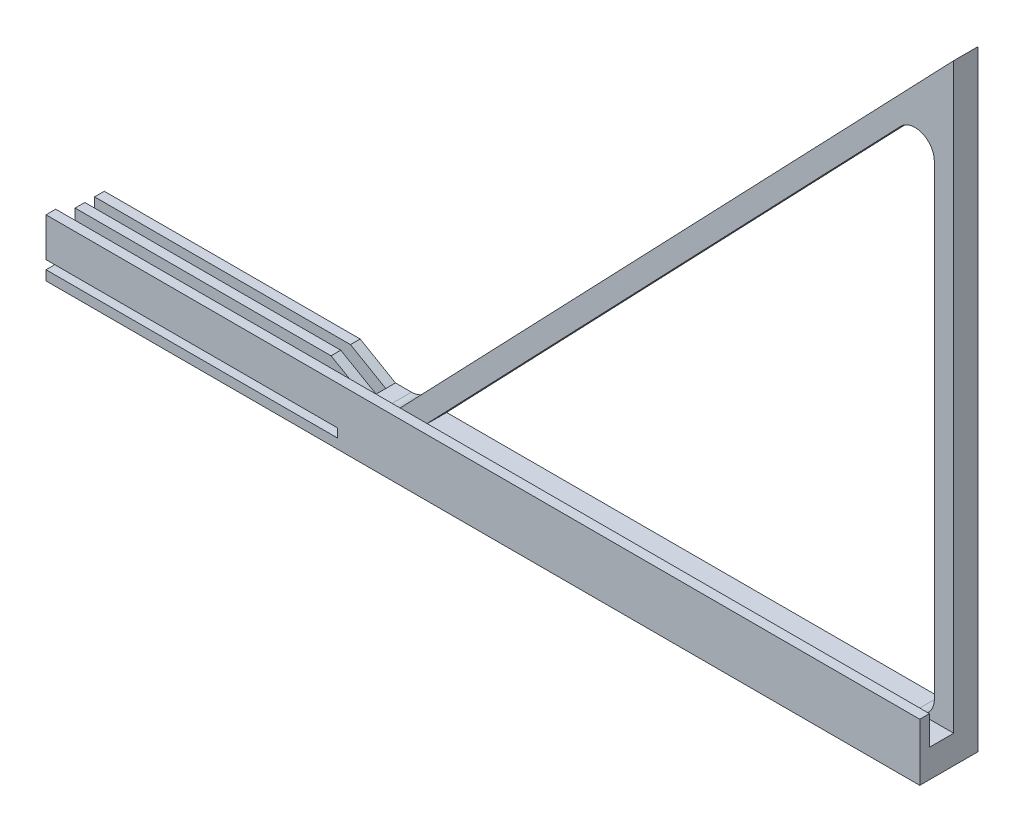
ISO-10303-21;
HEADER;
FILE_DESCRIPTION(('STEP AP214'),'2;1');
FILE_NAME('part.step','',(''),(''),'','','');
FILE_SCHEMA(('AUTOMOTIVE_DESIGN { 1 0 10303 214 1 1 1 1 }'));
ENDSEC;
DATA;
#1=APPLICATION_CONTEXT('core data for automotive mechanical design processes');
#2=APPLICATION_PROTOCOL_DEFINITION('international standard','automotive_design',2000,#1);
#3=PRODUCT_CONTEXT('',#1,'mechanical');
#4=PRODUCT('Part','Part','',(#3));
#5=PRODUCT_RELATED_PRODUCT_CATEGORY('part','',(#4));
#6=PRODUCT_DEFINITION_FORMATION('','',#4);
#7=PRODUCT_DEFINITION_CONTEXT('part definition',#1,'design');
#8=PRODUCT_DEFINITION('design','',#6,#7);
#9=PRODUCT_DEFINITION_SHAPE('','',#8);
#10=(LENGTH_UNIT() NAMED_UNIT(*) SI_UNIT(.MILLI.,.METRE.));
#11=(NAMED_UNIT(*) PLANE_ANGLE_UNIT() SI_UNIT($,.RADIAN.));
#12=(NAMED_UNIT(*) SI_UNIT($,.STERADIAN.) SOLID_ANGLE_UNIT());
#13=UNCERTAINTY_MEASURE_WITH_UNIT(LENGTH_MEASURE(1.E-05),#10,'distance_accuracy_value','');
#14=(GEOMETRIC_REPRESENTATION_CONTEXT(3) GLOBAL_UNCERTAINTY_ASSIGNED_CONTEXT((#13)) GLOBAL_UNIT_ASSIGNED_CONTEXT((#10,
#11,#12)) REPRESENTATION_CONTEXT('',''));
#15=CARTESIAN_POINT('',(0.,0.,0.));
#16=DIRECTION('',(0.,0.,1.));
#17=DIRECTION('',(1.,0.,0.));
#18=AXIS2_PLACEMENT_3D('',#15,#16,#17);
#19=CARTESIAN_POINT('',(228.6,7.36600000000004,15.24));
#20=DIRECTION('',(0.,-1.,0.));
#21=DIRECTION('',(1.,0.,0.));
#22=AXIS2_PLACEMENT_3D('',#19,#20,#21);
#23=PLANE('',#22);
#24=DIRECTION('',(-1.,0.,0.));
#25=VECTOR('',#24,1.);
#26=CARTESIAN_POINT('',(0.,7.36600000000001,12.7));
#27=LINE('',#26,#25);
#28=CARTESIAN_POINT('',(228.6,7.36600000000004,12.7));
#29=VERTEX_POINT('',#28);
#30=CARTESIAN_POINT('',(0.,7.36600000000001,12.7));
#31=VERTEX_POINT('',#30);
#32=EDGE_CURVE('E239',#29,#31,#27,.T.);
#33=ORIENTED_EDGE('',*,*,#32,.F.);
#34=DIRECTION('',(0.,0.,-1.));
#35=VECTOR('',#34,1.);
#36=CARTESIAN_POINT('',(228.6,7.36600000000004,15.24));
#37=LINE('',#36,#35);
#38=CARTESIAN_POINT('',(228.6,7.36600000000004,6.35));
#39=VERTEX_POINT('',#38);
#40=EDGE_CURVE('E358',#29,#39,#37,.T.);
#41=ORIENTED_EDGE('',*,*,#40,.T.);
#42=DIRECTION('',(1.,0.,0.));
#43=VECTOR('',#42,1.);
#44=CARTESIAN_POINT('',(223.52,7.36600000000004,6.35));
#45=LINE('',#44,#43);
#46=CARTESIAN_POINT('',(218.44,7.36600000000004,6.35));
#47=VERTEX_POINT('',#46);
#48=EDGE_CURVE('E297',#47,#39,#45,.T.);
#49=ORIENTED_EDGE('',*,*,#48,.F.);
#50=DIRECTION('',(0.,0.,-1.));
#51=VECTOR('',#50,1.);
#52=CARTESIAN_POINT('',(218.44,7.36600000000004,0.));
#53=LINE('',#52,#51);
#54=CARTESIAN_POINT('',(218.44,7.36600000000004,0.));
#55=VERTEX_POINT('',#54);
#56=EDGE_CURVE('E393',#47,#55,#53,.T.);
#57=ORIENTED_EDGE('',*,*,#56,.T.);
#58=DIRECTION('',(-1.,0.,0.));
#59=VECTOR('',#58,1.);
#60=CARTESIAN_POINT('',(228.6,7.36600000000004,0.));
#61=LINE('',#60,#59);
#62=CARTESIAN_POINT('',(89.5861260253383,7.36600000000002,0.));
#63=VERTEX_POINT('',#62);
#64=EDGE_CURVE('E344',#55,#63,#61,.T.);
#65=ORIENTED_EDGE('',*,*,#64,.T.);
#66=DIRECTION('',(0.,0.,-1.));
#67=VECTOR('',#66,1.);
#68=CARTESIAN_POINT('',(89.5861260253383,7.36600000000004,6.35));
#69=LINE('',#68,#67);
#70=CARTESIAN_POINT('',(89.5861260253383,7.36600000000002,6.35));
#71=VERTEX_POINT('',#70);
#72=EDGE_CURVE('E314',#71,#63,#69,.T.);
#73=ORIENTED_EDGE('',*,*,#72,.F.);
#74=DIRECTION('',(1.,0.,0.));
#75=VECTOR('',#74,1.);
#76=CARTESIAN_POINT('',(82.55,7.36600000000004,6.35));
#77=LINE('',#76,#75);
#78=CARTESIAN_POINT('',(80.3822073079949,7.36600000000004,6.35));
#79=VERTEX_POINT('',#78);
#80=EDGE_CURVE('E305',#79,#71,#77,.T.);
#81=ORIENTED_EDGE('',*,*,#80,.F.);
#82=DIRECTION('',(0.,0.,-1.));
#83=VECTOR('',#82,1.);
#84=CARTESIAN_POINT('',(80.3822073079949,7.36600000000002,0.));
#85=LINE('',#84,#83);
#86=CARTESIAN_POINT('',(80.3822073079949,7.36600000000002,0.));
#87=VERTEX_POINT('',#86);
#88=EDGE_CURVE('E396',#79,#87,#85,.T.);
#89=ORIENTED_EDGE('',*,*,#88,.T.);
#90=CARTESIAN_POINT('',(76.2,7.36600000000002,0.));
#91=VERTEX_POINT('',#90);
#92=EDGE_CURVE('E342',#87,#91,#61,.T.);
#93=ORIENTED_EDGE('',*,*,#92,.T.);
#94=DIRECTION('',(0.,0.,-1.));
#95=VECTOR('',#94,1.);
#96=CARTESIAN_POINT('',(76.2,7.36600000000002,15.24));
#97=LINE('',#96,#95);
#98=CARTESIAN_POINT('',(76.2,7.36600000000002,2.54));
#99=VERTEX_POINT('',#98);
#100=EDGE_CURVE('E289',#99,#91,#97,.T.);
#101=ORIENTED_EDGE('',*,*,#100,.F.);
#102=DIRECTION('',(0.,0.,1.));
#103=VECTOR('',#102,1.);
#104=CARTESIAN_POINT('',(76.2,7.36600000000002,15.24));
#105=LINE('',#104,#103);
#106=CARTESIAN_POINT('',(76.2,7.36600000000002,5.08));
#107=VERTEX_POINT('',#106);
#108=EDGE_CURVE('E269',#99,#107,#105,.T.);
#109=ORIENTED_EDGE('',*,*,#108,.T.);
#110=CARTESIAN_POINT('',(76.2,7.36600000000002,7.62));
#111=VERTEX_POINT('',#110);
#112=EDGE_CURVE('E290',#111,#107,#97,.T.);
#113=ORIENTED_EDGE('',*,*,#112,.F.);
#114=DIRECTION('',(1.,0.,0.));
#115=VECTOR('',#114,1.);
#116=CARTESIAN_POINT('',(228.6,7.36600000000004,7.62));
#117=LINE('',#116,#115);
#118=CARTESIAN_POINT('',(0.,7.36600000000001,7.62));
#119=VERTEX_POINT('',#118);
#120=EDGE_CURVE('E293',#119,#111,#117,.T.);
#121=ORIENTED_EDGE('',*,*,#120,.F.);
#122=DIRECTION('',(0.,0.,-1.));
#123=VECTOR('',#122,1.);
#124=CARTESIAN_POINT('',(0.,7.36600000000001,15.24));
#125=LINE('',#124,#123);
#126=EDGE_CURVE('E356',#31,#119,#125,.T.);
#127=ORIENTED_EDGE('',*,*,#126,.F.);
#128=EDGE_LOOP('',(#33,#41,#49,#57,#65,#73,#81,#89,#93,#101,#109,#113,#121,#127));
#129=FACE_BOUND('',#128,.T.);
#130=ADVANCED_FACE('F37',(#129),#23,.F.);
#131=CARTESIAN_POINT('',(0.,7.36600000000001,15.24));
#132=DIRECTION('',(1.,0.,0.));
#133=DIRECTION('',(0.,1.,0.));
#134=AXIS2_PLACEMENT_3D('',#131,#132,#133);
#135=PLANE('',#134);
#136=DIRECTION('',(0.,1.,0.));
#137=VECTOR('',#136,1.);
#138=CARTESIAN_POINT('',(0.,12.7,5.08));
#139=LINE('',#138,#137);
#140=CARTESIAN_POINT('',(0.,6.09600000000001,5.08));
#141=VERTEX_POINT('',#140);
#142=CARTESIAN_POINT('',(0.,12.7,5.08));
#143=VERTEX_POINT('',#142);
#144=EDGE_CURVE('E260',#141,#143,#139,.T.);
#145=ORIENTED_EDGE('',*,*,#144,.F.);
#146=CARTESIAN_POINT('',(0.,6.09600000000001,6.35));
#147=DIRECTION('',(1.,0.,0.));
#148=DIRECTION('',(0.,1.,0.));
#149=AXIS2_PLACEMENT_3D('',#146,#147,#148);
#150=CIRCLE('',#149,1.27);
#151=CARTESIAN_POINT('',(0.,4.82600000000001,6.35));
#152=VERTEX_POINT('',#151);
#153=EDGE_CURVE('E378',#141,#152,#150,.F.);
#154=ORIENTED_EDGE('',*,*,#153,.T.);
#155=DIRECTION('',(0.,0.,-1.));
#156=VECTOR('',#155,1.);
#157=CARTESIAN_POINT('',(0.,4.82600000000001,15.24));
#158=LINE('',#157,#156);
#159=CARTESIAN_POINT('',(0.,4.82600000000001,15.24));
#160=VERTEX_POINT('',#159);
#161=EDGE_CURVE('E220',#160,#152,#158,.T.);
#162=ORIENTED_EDGE('',*,*,#161,.F.);
#163=DIRECTION('',(0.,-1.,0.));
#164=VECTOR('',#163,1.);
#165=CARTESIAN_POINT('',(0.,7.36600000000001,15.24));
#166=LINE('',#165,#164);
#167=CARTESIAN_POINT('',(0.,14.986,15.24));
#168=VERTEX_POINT('',#167);
#169=EDGE_CURVE('E212',#168,#160,#166,.T.);
#170=ORIENTED_EDGE('',*,*,#169,.F.);
#171=DIRECTION('',(0.,0.,1.));
#172=VECTOR('',#171,1.);
#173=CARTESIAN_POINT('',(0.,14.986,15.24));
#174=LINE('',#173,#172);
#175=CARTESIAN_POINT('',(0.,14.986,12.7));
#176=VERTEX_POINT('',#175);
#177=EDGE_CURVE('E218',#176,#168,#174,.T.);
#178=ORIENTED_EDGE('',*,*,#177,.F.);
#179=DIRECTION('',(0.,-1.,0.));
#180=VECTOR('',#179,1.);
#181=CARTESIAN_POINT('',(0.,14.986,12.7));
#182=LINE('',#181,#180);
#183=EDGE_CURVE('E244',#176,#31,#182,.T.);
#184=ORIENTED_EDGE('',*,*,#183,.T.);
#185=ORIENTED_EDGE('',*,*,#126,.T.);
#186=DIRECTION('',(0.,-1.,0.));
#187=VECTOR('',#186,1.);
#188=CARTESIAN_POINT('',(0.,0.,7.62));
#189=LINE('',#188,#187);
#190=CARTESIAN_POINT('',(0.,12.7,7.62));
#191=VERTEX_POINT('',#190);
#192=EDGE_CURVE('E279',#191,#119,#189,.T.);
#193=ORIENTED_EDGE('',*,*,#192,.F.);
#194=DIRECTION('',(0.,0.,-1.));
#195=VECTOR('',#194,1.);
#196=CARTESIAN_POINT('',(0.,12.7,7.62));
#197=LINE('',#196,#195);
#198=EDGE_CURVE('E286',#191,#143,#197,.T.);
#199=ORIENTED_EDGE('',*,*,#198,.T.);
#200=EDGE_LOOP('',(#145,#154,#162,#170,#178,#184,#185,#193,#199));
#201=FACE_BOUND('',#200,.T.);
#202=ADVANCED_FACE('F215',(#201),#135,.F.);
#203=CARTESIAN_POINT('',(0.,12.7,7.62));
#204=DIRECTION('',(0.,-1.,0.));
#205=DIRECTION('',(0.,0.,-1.));
#206=AXIS2_PLACEMENT_3D('',#203,#204,#205);
#207=PLANE('',#206);
#208=DIRECTION('',(-1.,0.,0.));
#209=VECTOR('',#208,1.);
#210=CARTESIAN_POINT('',(0.,12.7,7.62));
#211=LINE('',#210,#209);
#212=CARTESIAN_POINT('',(66.9612409924277,12.7,7.62));
#213=VERTEX_POINT('',#212);
#214=EDGE_CURVE('E282',#213,#191,#211,.T.);
#215=ORIENTED_EDGE('',*,*,#214,.F.);
#216=DIRECTION('',(0.,0.,1.));
#217=VECTOR('',#216,1.);
#218=CARTESIAN_POINT('',(66.9612409924277,12.7,0.));
#219=LINE('',#218,#217);
#220=CARTESIAN_POINT('',(66.9612409924277,12.7,5.08));
#221=VERTEX_POINT('',#220);
#222=EDGE_CURVE('E253',#221,#213,#219,.T.);
#223=ORIENTED_EDGE('',*,*,#222,.F.);
#224=DIRECTION('',(-1.,0.,0.));
#225=VECTOR('',#224,1.);
#226=CARTESIAN_POINT('',(87.5592253256989,12.7,5.08));
#227=LINE('',#226,#225);
#228=EDGE_CURVE('E272',#221,#143,#227,.T.);
#229=ORIENTED_EDGE('',*,*,#228,.T.);
#230=ORIENTED_EDGE('',*,*,#198,.F.);
#231=EDGE_LOOP('',(#215,#223,#229,#230));
#232=FACE_BOUND('',#231,.T.);
#233=ADVANCED_FACE('F501',(#232),#207,.F.);
#234=CARTESIAN_POINT('',(0.,4.82600000000001,15.24));
#235=DIRECTION('',(0.,1.,0.));
#236=DIRECTION('',(0.,0.,1.));
#237=AXIS2_PLACEMENT_3D('',#234,#235,#236);
#238=PLANE('',#237);
#239=ORIENTED_EDGE('',*,*,#161,.T.);
#240=DIRECTION('',(-1.,0.,0.));
#241=VECTOR('',#240,1.);
#242=CARTESIAN_POINT('',(0.,4.82600000000001,6.35));
#243=LINE('',#242,#241);
#244=CARTESIAN_POINT('',(76.2,4.82600000000001,6.35));
#245=VERTEX_POINT('',#244);
#246=EDGE_CURVE('E380',#152,#245,#243,.F.);
#247=ORIENTED_EDGE('',*,*,#246,.T.);
#248=DIRECTION('',(0.,0.,-1.));
#249=VECTOR('',#248,1.);
#250=CARTESIAN_POINT('',(76.2,4.82600000000001,15.24));
#251=LINE('',#250,#249);
#252=CARTESIAN_POINT('',(76.2,4.82600000000001,15.24));
#253=VERTEX_POINT('',#252);
#254=EDGE_CURVE('E352',#253,#245,#251,.T.);
#255=ORIENTED_EDGE('',*,*,#254,.F.);
#256=DIRECTION('',(1.,0.,0.));
#257=VECTOR('',#256,1.);
#258=CARTESIAN_POINT('',(0.,4.82600000000001,15.24));
#259=LINE('',#258,#257);
#260=EDGE_CURVE('E223',#160,#253,#259,.T.);
#261=ORIENTED_EDGE('',*,*,#260,.F.);
#262=EDGE_LOOP('',(#239,#247,#255,#261));
#263=FACE_BOUND('',#262,.T.);
#264=ADVANCED_FACE('F694',(#263),#238,.F.);
#265=CARTESIAN_POINT('',(76.2,4.82600000000001,15.24));
#266=DIRECTION('',(1.,0.,0.));
#267=DIRECTION('',(0.,0.,-1.));
#268=AXIS2_PLACEMENT_3D('',#265,#266,#267);
#269=PLANE('',#268);
#270=DIRECTION('',(0.,-1.,0.));
#271=VECTOR('',#270,1.);
#272=CARTESIAN_POINT('',(76.2,2.54000000000001,2.54));
#273=LINE('',#272,#271);
#274=CARTESIAN_POINT('',(76.2,3.81000000000001,2.54));
#275=VERTEX_POINT('',#274);
#276=EDGE_CURVE('E266',#99,#275,#273,.T.);
#277=ORIENTED_EDGE('',*,*,#276,.T.);
#278=CARTESIAN_POINT('',(76.2,3.81000000000001,3.81));
#279=DIRECTION('',(1.,0.,0.));
#280=DIRECTION('',(0.,0.,-1.));
#281=AXIS2_PLACEMENT_3D('',#278,#279,#280);
#282=CIRCLE('',#281,1.27);
#283=CARTESIAN_POINT('',(76.2,2.54000000000001,3.81));
#284=VERTEX_POINT('',#283);
#285=EDGE_CURVE('E373',#275,#284,#282,.F.);
#286=ORIENTED_EDGE('',*,*,#285,.T.);
#287=DIRECTION('',(0.,0.,-1.));
#288=VECTOR('',#287,1.);
#289=CARTESIAN_POINT('',(76.2,2.54000000000001,15.24));
#290=LINE('',#289,#288);
#291=CARTESIAN_POINT('',(76.2,2.54000000000001,15.24));
#292=VERTEX_POINT('',#291);
#293=EDGE_CURVE('E349',#292,#284,#290,.T.);
#294=ORIENTED_EDGE('',*,*,#293,.F.);
#295=DIRECTION('',(0.,-1.,0.));
#296=VECTOR('',#295,1.);
#297=CARTESIAN_POINT('',(76.2,4.82600000000001,15.24));
#298=LINE('',#297,#296);
#299=EDGE_CURVE('E334',#253,#292,#298,.T.);
#300=ORIENTED_EDGE('',*,*,#299,.F.);
#301=ORIENTED_EDGE('',*,*,#254,.T.);
#302=CARTESIAN_POINT('',(76.2,6.09600000000001,6.35));
#303=DIRECTION('',(1.,0.,0.));
#304=DIRECTION('',(0.,0.,-1.));
#305=AXIS2_PLACEMENT_3D('',#302,#303,#304);
#306=CIRCLE('',#305,1.27);
#307=CARTESIAN_POINT('',(76.2,6.09600000000001,5.08));
#308=VERTEX_POINT('',#307);
#309=EDGE_CURVE('E384',#245,#308,#306,.T.);
#310=ORIENTED_EDGE('',*,*,#309,.T.);
#311=DIRECTION('',(0.,1.,0.));
#312=VECTOR('',#311,1.);
#313=CARTESIAN_POINT('',(76.2,12.7,5.08));
#314=LINE('',#313,#312);
#315=EDGE_CURVE('E264',#308,#107,#314,.T.);
#316=ORIENTED_EDGE('',*,*,#315,.T.);
#317=ORIENTED_EDGE('',*,*,#108,.F.);
#318=EDGE_LOOP('',(#277,#286,#294,#300,#301,#310,#316,#317));
#319=FACE_BOUND('',#318,.T.);
#320=ADVANCED_FACE('F466',(#319),#269,.F.);
#321=CARTESIAN_POINT('',(76.2,2.54000000000001,15.24));
#322=DIRECTION('',(0.,-1.,0.));
#323=DIRECTION('',(1.,0.,0.));
#324=AXIS2_PLACEMENT_3D('',#321,#322,#323);
#325=PLANE('',#324);
#326=ORIENTED_EDGE('',*,*,#293,.T.);
#327=DIRECTION('',(-1.,0.,0.));
#328=VECTOR('',#327,1.);
#329=CARTESIAN_POINT('',(0.,2.54,3.81));
#330=LINE('',#329,#328);
#331=CARTESIAN_POINT('',(0.,2.54,3.81));
#332=VERTEX_POINT('',#331);
#333=EDGE_CURVE('E368',#284,#332,#330,.T.);
#334=ORIENTED_EDGE('',*,*,#333,.T.);
#335=DIRECTION('',(0.,0.,-1.));
#336=VECTOR('',#335,1.);
#337=CARTESIAN_POINT('',(0.,2.54,15.24));
#338=LINE('',#337,#336);
#339=CARTESIAN_POINT('',(0.,2.54,15.24));
#340=VERTEX_POINT('',#339);
#341=EDGE_CURVE('E338',#340,#332,#338,.T.);
#342=ORIENTED_EDGE('',*,*,#341,.F.);
#343=DIRECTION('',(-1.,0.,0.));
#344=VECTOR('',#343,1.);
#345=CARTESIAN_POINT('',(76.2,2.54000000000001,15.24));
#346=LINE('',#345,#344);
#347=EDGE_CURVE('E336',#292,#340,#346,.T.);
#348=ORIENTED_EDGE('',*,*,#347,.F.);
#349=EDGE_LOOP('',(#326,#334,#342,#348));
#350=FACE_BOUND('',#349,.T.);
#351=ADVANCED_FACE('F461',(#350),#325,.F.);
#352=CARTESIAN_POINT('',(0.,0.,15.24));
#353=DIRECTION('',(0.,1.,0.));
#354=DIRECTION('',(0.,0.,1.));
#355=AXIS2_PLACEMENT_3D('',#352,#353,#354);
#356=PLANE('',#355);
#357=DIRECTION('',(1.,0.,0.));
#358=VECTOR('',#357,1.);
#359=CARTESIAN_POINT('',(0.,0.,0.));
#360=LINE('',#359,#358);
#361=CARTESIAN_POINT('',(0.,0.,0.));
#362=VERTEX_POINT('',#361);
#363=CARTESIAN_POINT('',(228.6,0.,0.));
#364=VERTEX_POINT('',#363);
#365=EDGE_CURVE('E326',#362,#364,#360,.T.);
#366=ORIENTED_EDGE('',*,*,#365,.T.);
#367=DIRECTION('',(0.,0.,-1.));
#368=VECTOR('',#367,1.);
#369=CARTESIAN_POINT('',(228.6,0.,15.24));
#370=LINE('',#369,#368);
#371=CARTESIAN_POINT('',(228.6,0.,15.24));
#372=VERTEX_POINT('',#371);
#373=EDGE_CURVE('E360',#372,#364,#370,.T.);
#374=ORIENTED_EDGE('',*,*,#373,.F.);
#375=DIRECTION('',(1.,0.,0.));
#376=VECTOR('',#375,1.);
#377=CARTESIAN_POINT('',(0.,0.,15.24));
#378=LINE('',#377,#376);
#379=CARTESIAN_POINT('',(0.,0.,15.24));
#380=VERTEX_POINT('',#379);
#381=EDGE_CURVE('E329',#380,#372,#378,.T.);
#382=ORIENTED_EDGE('',*,*,#381,.F.);
#383=DIRECTION('',(0.,0.,-1.));
#384=VECTOR('',#383,1.);
#385=CARTESIAN_POINT('',(0.,0.,15.24));
#386=LINE('',#385,#384);
#387=EDGE_CURVE('E363',#380,#362,#386,.T.);
#388=ORIENTED_EDGE('',*,*,#387,.T.);
#389=EDGE_LOOP('',(#366,#374,#382,#388));
#390=FACE_BOUND('',#389,.T.);
#391=ADVANCED_FACE('F507',(#390),#356,.F.);
#392=CARTESIAN_POINT('',(228.6,0.,15.24));
#393=DIRECTION('',(-1.,0.,0.));
#394=DIRECTION('',(0.,0.,1.));
#395=AXIS2_PLACEMENT_3D('',#392,#393,#394);
#396=PLANE('',#395);
#397=DIRECTION('',(0.,1.,0.));
#398=VECTOR('',#397,1.);
#399=CARTESIAN_POINT('',(228.6,0.,0.));
#400=LINE('',#399,#398);
#401=CARTESIAN_POINT('',(228.6,159.766,0.));
#402=VERTEX_POINT('',#401);
#403=EDGE_CURVE('E340',#364,#402,#400,.T.);
#404=ORIENTED_EDGE('',*,*,#403,.T.);
#405=DIRECTION('',(0.,0.,-1.));
#406=VECTOR('',#405,1.);
#407=CARTESIAN_POINT('',(228.6,159.766,6.35));
#408=LINE('',#407,#406);
#409=CARTESIAN_POINT('',(228.6,159.766,6.35));
#410=VERTEX_POINT('',#409);
#411=EDGE_CURVE('E323',#410,#402,#408,.T.);
#412=ORIENTED_EDGE('',*,*,#411,.F.);
#413=DIRECTION('',(0.,1.,0.));
#414=VECTOR('',#413,1.);
#415=CARTESIAN_POINT('',(228.6,7.36600000000004,6.35));
#416=LINE('',#415,#414);
#417=EDGE_CURVE('E300',#39,#410,#416,.T.);
#418=ORIENTED_EDGE('',*,*,#417,.F.);
#419=ORIENTED_EDGE('',*,*,#40,.F.);
#420=DIRECTION('',(0.,-1.,0.));
#421=VECTOR('',#420,1.);
#422=CARTESIAN_POINT('',(228.6,14.986,12.7));
#423=LINE('',#422,#421);
#424=CARTESIAN_POINT('',(228.6,14.986,12.7));
#425=VERTEX_POINT('',#424);
#426=EDGE_CURVE('E247',#425,#29,#423,.T.);
#427=ORIENTED_EDGE('',*,*,#426,.F.);
#428=DIRECTION('',(0.,0.,-1.));
#429=VECTOR('',#428,1.);
#430=CARTESIAN_POINT('',(228.6,14.986,15.24));
#431=LINE('',#430,#429);
#432=CARTESIAN_POINT('',(228.6,14.986,15.24));
#433=VERTEX_POINT('',#432);
#434=EDGE_CURVE('E233',#433,#425,#431,.T.);
#435=ORIENTED_EDGE('',*,*,#434,.F.);
#436=DIRECTION('',(0.,1.,0.));
#437=VECTOR('',#436,1.);
#438=CARTESIAN_POINT('',(228.6,0.,15.24));
#439=LINE('',#438,#437);
#440=EDGE_CURVE('E224',#372,#433,#439,.T.);
#441=ORIENTED_EDGE('',*,*,#440,.F.);
#442=ORIENTED_EDGE('',*,*,#373,.T.);
#443=EDGE_LOOP('',(#404,#412,#418,#419,#427,#435,#441,#442));
#444=FACE_BOUND('',#443,.T.);
#445=ADVANCED_FACE('F483',(#444),#396,.F.);
#446=ORIENTED_EDGE('',*,*,#341,.T.);
#447=CARTESIAN_POINT('',(0.,3.81,3.81));
#448=DIRECTION('',(1.,0.,0.));
#449=DIRECTION('',(0.,1.,0.));
#450=AXIS2_PLACEMENT_3D('',#447,#448,#449);
#451=CIRCLE('',#450,1.27);
#452=CARTESIAN_POINT('',(0.,3.81,2.54));
#453=VERTEX_POINT('',#452);
#454=EDGE_CURVE('E382',#332,#453,#451,.T.);
#455=ORIENTED_EDGE('',*,*,#454,.T.);
#456=DIRECTION('',(0.,-1.,0.));
#457=VECTOR('',#456,1.);
#458=CARTESIAN_POINT('',(0.,2.54,2.54));
#459=LINE('',#458,#457);
#460=CARTESIAN_POINT('',(0.,12.7,2.54));
#461=VERTEX_POINT('',#460);
#462=EDGE_CURVE('E261',#461,#453,#459,.T.);
#463=ORIENTED_EDGE('',*,*,#462,.F.);
#464=CARTESIAN_POINT('',(0.,12.7,0.));
#465=VERTEX_POINT('',#464);
#466=EDGE_CURVE('E284',#461,#465,#197,.T.);
#467=ORIENTED_EDGE('',*,*,#466,.T.);
#468=DIRECTION('',(0.,-1.,0.));
#469=VECTOR('',#468,1.);
#470=CARTESIAN_POINT('',(0.,7.36600000000001,0.));
#471=LINE('',#470,#469);
#472=EDGE_CURVE('E330',#465,#362,#471,.T.);
#473=ORIENTED_EDGE('',*,*,#472,.T.);
#474=ORIENTED_EDGE('',*,*,#387,.F.);
#475=DIRECTION('',(0.,-1.,0.));
#476=VECTOR('',#475,1.);
#477=CARTESIAN_POINT('',(0.,2.54,15.24));
#478=LINE('',#477,#476);
#479=EDGE_CURVE('E327',#340,#380,#478,.T.);
#480=ORIENTED_EDGE('',*,*,#479,.F.);
#481=EDGE_LOOP('',(#446,#455,#463,#467,#473,#474,#480));
#482=FACE_BOUND('',#481,.T.);
#483=ADVANCED_FACE('F453',(#482),#135,.F.);
#484=CARTESIAN_POINT('',(0.,0.,15.24));
#485=DIRECTION('',(0.,0.,1.));
#486=DIRECTION('',(1.,0.,0.));
#487=AXIS2_PLACEMENT_3D('',#484,#485,#486);
#488=PLANE('',#487);
#489=ORIENTED_EDGE('',*,*,#479,.T.);
#490=ORIENTED_EDGE('',*,*,#381,.T.);
#491=ORIENTED_EDGE('',*,*,#440,.T.);
#492=DIRECTION('',(1.,0.,0.));
#493=VECTOR('',#492,1.);
#494=CARTESIAN_POINT('',(0.,14.986,15.24));
#495=LINE('',#494,#493);
#496=EDGE_CURVE('E227',#168,#433,#495,.T.);
#497=ORIENTED_EDGE('',*,*,#496,.F.);
#498=ORIENTED_EDGE('',*,*,#169,.T.);
#499=ORIENTED_EDGE('',*,*,#260,.T.);
#500=ORIENTED_EDGE('',*,*,#299,.T.);
#501=ORIENTED_EDGE('',*,*,#347,.T.);
#502=EDGE_LOOP('',(#489,#490,#491,#497,#498,#499,#500,#501));
#503=FACE_BOUND('',#502,.T.);
#504=ADVANCED_FACE('F229',(#503),#488,.T.);
#505=CARTESIAN_POINT('',(0.,0.,0.));
#506=DIRECTION('',(0.,0.,1.));
#507=DIRECTION('',(1.,0.,0.));
#508=AXIS2_PLACEMENT_3D('',#505,#506,#507);
#509=PLANE('',#508);
#510=DIRECTION('',(-1.,0.,0.));
#511=VECTOR('',#510,1.);
#512=CARTESIAN_POINT('',(0.,12.7,0.));
#513=LINE('',#512,#511);
#514=CARTESIAN_POINT('',(66.9612409924277,12.7,0.));
#515=VERTEX_POINT('',#514);
#516=EDGE_CURVE('E278',#515,#465,#513,.T.);
#517=ORIENTED_EDGE('',*,*,#516,.F.);
#518=DIRECTION('',(0.866025403784436,-0.500000000000004,0.));
#519=VECTOR('',#518,1.);
#520=CARTESIAN_POINT('',(76.2,7.36600000000002,0.));
#521=LINE('',#520,#519);
#522=EDGE_CURVE('E250',#515,#91,#521,.T.);
#523=ORIENTED_EDGE('',*,*,#522,.T.);
#524=ORIENTED_EDGE('',*,*,#92,.F.);
#525=CARTESIAN_POINT('',(80.3822073079949,12.446,0.));
#526=DIRECTION('',(0.,0.,1.));
#527=DIRECTION('',(1.,0.,0.));
#528=AXIS2_PLACEMENT_3D('',#525,#526,#527);
#529=CIRCLE('',#528,5.08);
#530=CARTESIAN_POINT('',(84.0499073899812,8.9311207547631,0.));
#531=VERTEX_POINT('',#530);
#532=EDGE_CURVE('E60',#87,#531,#529,.T.);
#533=ORIENTED_EDGE('',*,*,#532,.T.);
#534=DIRECTION('',(-0.691905363235615,-0.721988205115424,0.));
#535=VECTOR('',#534,1.);
#536=CARTESIAN_POINT('',(228.6,159.766,0.));
#537=LINE('',#536,#535);
#538=EDGE_CURVE('E296',#402,#531,#537,.T.);
#539=ORIENTED_EDGE('',*,*,#538,.F.);
#540=ORIENTED_EDGE('',*,*,#403,.F.);
#541=ORIENTED_EDGE('',*,*,#365,.F.);
#542=ORIENTED_EDGE('',*,*,#472,.F.);
#543=EDGE_LOOP('',(#517,#523,#524,#533,#539,#540,#541,#542));
#544=FACE_BOUND('',#543,.T.);
#545=ORIENTED_EDGE('',*,*,#64,.F.);
#546=CARTESIAN_POINT('',(218.44,12.446,0.));
#547=DIRECTION('',(0.,0.,1.));
#548=DIRECTION('',(1.,0.,0.));
#549=AXIS2_PLACEMENT_3D('',#546,#547,#548);
#550=CIRCLE('',#549,5.08);
#551=CARTESIAN_POINT('',(223.52,12.446,0.));
#552=VERTEX_POINT('',#551);
#553=EDGE_CURVE('E45',#55,#552,#550,.T.);
#554=ORIENTED_EDGE('',*,*,#553,.T.);
#555=DIRECTION('',(0.,-1.,0.));
#556=VECTOR('',#555,1.);
#557=CARTESIAN_POINT('',(223.52,7.36600000000004,0.));
#558=LINE('',#557,#556);
#559=CARTESIAN_POINT('',(223.52,134.480171773207,0.));
#560=VERTEX_POINT('',#559);
#561=EDGE_CURVE('E301',#560,#552,#558,.T.);
#562=ORIENTED_EDGE('',*,*,#561,.F.);
#563=CARTESIAN_POINT('',(218.44,134.480171773207,0.));
#564=DIRECTION('',(0.,0.,1.));
#565=DIRECTION('',(1.,0.,0.));
#566=AXIS2_PLACEMENT_3D('',#563,#564,#565);
#567=CIRCLE('',#566,5.08);
#568=CARTESIAN_POINT('',(214.772299918014,137.995051018444,0.));
#569=VERTEX_POINT('',#568);
#570=EDGE_CURVE('E400',#560,#569,#567,.T.);
#571=ORIENTED_EDGE('',*,*,#570,.T.);
#572=DIRECTION('',(0.691905363235615,0.721988205115424,0.));
#573=VECTOR('',#572,1.);
#574=CARTESIAN_POINT('',(223.52,147.123085886603,0.));
#575=LINE('',#574,#573);
#576=EDGE_CURVE('E316',#63,#569,#575,.T.);
#577=ORIENTED_EDGE('',*,*,#576,.F.);
#578=EDGE_LOOP('',(#545,#554,#562,#571,#577));
#579=FACE_BOUND('',#578,.T.);
#580=ADVANCED_FACE('F410',(#544,#579),#509,.F.);
#581=CARTESIAN_POINT('',(228.6,159.766,6.35));
#582=DIRECTION('',(0.721988205115424,-0.691905363235615,0.));
#583=DIRECTION('',(0.691905363235615,0.721988205115424,0.));
#584=AXIS2_PLACEMENT_3D('',#581,#582,#583);
#585=PLANE('',#584);
#586=ORIENTED_EDGE('',*,*,#538,.T.);
#587=DIRECTION('',(0.,0.,-1.));
#588=VECTOR('',#587,1.);
#589=CARTESIAN_POINT('',(84.0499073899812,8.9311207547631,6.35));
#590=LINE('',#589,#588);
#591=CARTESIAN_POINT('',(84.0499073899812,8.9311207547631,6.35));
#592=VERTEX_POINT('',#591);
#593=EDGE_CURVE('E52',#531,#592,#590,.F.);
#594=ORIENTED_EDGE('',*,*,#593,.T.);
#595=DIRECTION('',(-0.691905363235615,-0.721988205115424,0.));
#596=VECTOR('',#595,1.);
#597=CARTESIAN_POINT('',(228.6,159.766,6.35));
#598=LINE('',#597,#596);
#599=EDGE_CURVE('E303',#410,#592,#598,.T.);
#600=ORIENTED_EDGE('',*,*,#599,.F.);
#601=ORIENTED_EDGE('',*,*,#411,.T.);
#602=EDGE_LOOP('',(#586,#594,#600,#601));
#603=FACE_BOUND('',#602,.T.);
#604=ADVANCED_FACE('F486',(#603),#585,.F.);
#605=CARTESIAN_POINT('',(223.52,147.123085886603,6.35));
#606=DIRECTION('',(-0.721988205115424,0.691905363235615,0.));
#607=DIRECTION('',(-0.691905363235615,-0.721988205115424,0.));
#608=AXIS2_PLACEMENT_3D('',#605,#606,#607);
#609=PLANE('',#608);
#610=ORIENTED_EDGE('',*,*,#576,.T.);
#611=DIRECTION('',(0.,0.,-1.));
#612=VECTOR('',#611,1.);
#613=CARTESIAN_POINT('',(214.772299918014,137.995051018444,6.35));
#614=LINE('',#613,#612);
#615=CARTESIAN_POINT('',(214.772299918014,137.995051018444,6.35));
#616=VERTEX_POINT('',#615);
#617=EDGE_CURVE('E391',#569,#616,#614,.F.);
#618=ORIENTED_EDGE('',*,*,#617,.T.);
#619=DIRECTION('',(0.691905363235615,0.721988205115424,0.));
#620=VECTOR('',#619,1.);
#621=CARTESIAN_POINT('',(223.52,147.123085886603,6.35));
#622=LINE('',#621,#620);
#623=EDGE_CURVE('E308',#71,#616,#622,.T.);
#624=ORIENTED_EDGE('',*,*,#623,.F.);
#625=ORIENTED_EDGE('',*,*,#72,.T.);
#626=EDGE_LOOP('',(#610,#618,#624,#625));
#627=FACE_BOUND('',#626,.T.);
#628=ADVANCED_FACE('F427',(#627),#609,.F.);
#629=CARTESIAN_POINT('',(223.52,7.36600000000004,6.35));
#630=DIRECTION('',(1.,0.,0.));
#631=DIRECTION('',(0.,0.,-1.));
#632=AXIS2_PLACEMENT_3D('',#629,#630,#631);
#633=PLANE('',#632);
#634=DIRECTION('',(0.,-1.,0.));
#635=VECTOR('',#634,1.);
#636=CARTESIAN_POINT('',(223.52,7.36600000000004,6.35));
#637=LINE('',#636,#635);
#638=CARTESIAN_POINT('',(223.52,134.480171773207,6.35));
#639=VERTEX_POINT('',#638);
#640=CARTESIAN_POINT('',(223.52,12.446,6.35));
#641=VERTEX_POINT('',#640);
#642=EDGE_CURVE('E311',#639,#641,#637,.T.);
#643=ORIENTED_EDGE('',*,*,#642,.F.);
#644=DIRECTION('',(0.,0.,-1.));
#645=VECTOR('',#644,1.);
#646=CARTESIAN_POINT('',(223.52,134.480171773207,0.));
#647=LINE('',#646,#645);
#648=EDGE_CURVE('E388',#639,#560,#647,.T.);
#649=ORIENTED_EDGE('',*,*,#648,.T.);
#650=ORIENTED_EDGE('',*,*,#561,.T.);
#651=DIRECTION('',(0.,0.,-1.));
#652=VECTOR('',#651,1.);
#653=CARTESIAN_POINT('',(223.52,12.446,6.35));
#654=LINE('',#653,#652);
#655=EDGE_CURVE('E386',#552,#641,#654,.F.);
#656=ORIENTED_EDGE('',*,*,#655,.T.);
#657=EDGE_LOOP('',(#643,#649,#650,#656));
#658=FACE_BOUND('',#657,.T.);
#659=ADVANCED_FACE('F417',(#658),#633,.F.);
#660=CARTESIAN_POINT('',(0.,0.,6.35));
#661=DIRECTION('',(0.,0.,1.));
#662=DIRECTION('',(1.,0.,0.));
#663=AXIS2_PLACEMENT_3D('',#660,#661,#662);
#664=PLANE('',#663);
#665=ORIENTED_EDGE('',*,*,#48,.T.);
#666=ORIENTED_EDGE('',*,*,#417,.T.);
#667=ORIENTED_EDGE('',*,*,#599,.T.);
#668=CARTESIAN_POINT('',(80.3822073079949,12.446,6.35));
#669=DIRECTION('',(0.,0.,1.));
#670=DIRECTION('',(1.,0.,0.));
#671=AXIS2_PLACEMENT_3D('',#668,#669,#670);
#672=CIRCLE('',#671,5.08);
#673=EDGE_CURVE('E405',#592,#79,#672,.F.);
#674=ORIENTED_EDGE('',*,*,#673,.T.);
#675=ORIENTED_EDGE('',*,*,#80,.T.);
#676=ORIENTED_EDGE('',*,*,#623,.T.);
#677=CARTESIAN_POINT('',(218.44,134.480171773207,6.35));
#678=DIRECTION('',(0.,0.,1.));
#679=DIRECTION('',(1.,0.,0.));
#680=AXIS2_PLACEMENT_3D('',#677,#678,#679);
#681=CIRCLE('',#680,5.08);
#682=EDGE_CURVE('E402',#616,#639,#681,.F.);
#683=ORIENTED_EDGE('',*,*,#682,.T.);
#684=ORIENTED_EDGE('',*,*,#642,.T.);
#685=CARTESIAN_POINT('',(218.44,12.446,6.35));
#686=DIRECTION('',(0.,0.,1.));
#687=DIRECTION('',(1.,0.,0.));
#688=AXIS2_PLACEMENT_3D('',#685,#686,#687);
#689=CIRCLE('',#688,5.08);
#690=EDGE_CURVE('E11',#641,#47,#689,.F.);
#691=ORIENTED_EDGE('',*,*,#690,.T.);
#692=EDGE_LOOP('',(#665,#666,#667,#674,#675,#676,#683,#684,#691));
#693=FACE_BOUND('',#692,.T.);
#694=ADVANCED_FACE('F421',(#693),#664,.T.);
#695=CARTESIAN_POINT('',(0.,0.,7.62));
#696=DIRECTION('',(0.,0.,-1.));
#697=DIRECTION('',(-1.,0.,0.));
#698=AXIS2_PLACEMENT_3D('',#695,#696,#697);
#699=PLANE('',#698);
#700=ORIENTED_EDGE('',*,*,#120,.T.);
#701=DIRECTION('',(0.866025403784436,-0.500000000000004,0.));
#702=VECTOR('',#701,1.);
#703=CARTESIAN_POINT('',(76.2,7.36600000000002,7.62));
#704=LINE('',#703,#702);
#705=EDGE_CURVE('E249',#213,#111,#704,.T.);
#706=ORIENTED_EDGE('',*,*,#705,.F.);
#707=ORIENTED_EDGE('',*,*,#214,.T.);
#708=ORIENTED_EDGE('',*,*,#192,.T.);
#709=EDGE_LOOP('',(#700,#706,#707,#708));
#710=FACE_BOUND('',#709,.T.);
#711=ADVANCED_FACE('F474',(#710),#699,.F.);
#712=DIRECTION('',(-1.,0.,0.));
#713=VECTOR('',#712,1.);
#714=CARTESIAN_POINT('',(87.5592253256989,12.7,2.54));
#715=LINE('',#714,#713);
#716=CARTESIAN_POINT('',(66.9612409924277,12.7,2.54));
#717=VERTEX_POINT('',#716);
#718=EDGE_CURVE('E270',#717,#461,#715,.T.);
#719=ORIENTED_EDGE('',*,*,#718,.F.);
#720=EDGE_CURVE('E255',#515,#717,#219,.T.);
#721=ORIENTED_EDGE('',*,*,#720,.F.);
#722=ORIENTED_EDGE('',*,*,#516,.T.);
#723=ORIENTED_EDGE('',*,*,#466,.F.);
#724=EDGE_LOOP('',(#719,#721,#722,#723));
#725=FACE_BOUND('',#724,.T.);
#726=ADVANCED_FACE('F444',(#725),#207,.F.);
#727=CARTESIAN_POINT('',(87.5592253256989,12.7,5.08));
#728=DIRECTION('',(0.,0.,1.));
#729=DIRECTION('',(0.,-1.,0.));
#730=AXIS2_PLACEMENT_3D('',#727,#728,#729);
#731=PLANE('',#730);
#732=ORIENTED_EDGE('',*,*,#315,.F.);
#733=DIRECTION('',(-1.,0.,0.));
#734=VECTOR('',#733,1.);
#735=CARTESIAN_POINT('',(87.5592253256989,6.09600000000001,5.08));
#736=LINE('',#735,#734);
#737=EDGE_CURVE('E375',#308,#141,#736,.T.);
#738=ORIENTED_EDGE('',*,*,#737,.T.);
#739=ORIENTED_EDGE('',*,*,#144,.T.);
#740=ORIENTED_EDGE('',*,*,#228,.F.);
#741=DIRECTION('',(0.866025403784437,-0.500000000000004,0.));
#742=VECTOR('',#741,1.);
#743=CARTESIAN_POINT('',(82.409729242381,3.7808111503166,5.08));
#744=LINE('',#743,#742);
#745=EDGE_CURVE('E257',#221,#107,#744,.T.);
#746=ORIENTED_EDGE('',*,*,#745,.T.);
#747=EDGE_LOOP('',(#732,#738,#739,#740,#746));
#748=FACE_BOUND('',#747,.T.);
#749=ADVANCED_FACE('F537',(#748),#731,.F.);
#750=CARTESIAN_POINT('',(87.5592253256989,2.54000000000001,2.54));
#751=DIRECTION('',(0.,0.,-1.));
#752=DIRECTION('',(0.,1.,0.));
#753=AXIS2_PLACEMENT_3D('',#750,#751,#752);
#754=PLANE('',#753);
#755=ORIENTED_EDGE('',*,*,#462,.T.);
#756=DIRECTION('',(-1.,0.,0.));
#757=VECTOR('',#756,1.);
#758=CARTESIAN_POINT('',(76.2,3.81000000000001,2.54));
#759=LINE('',#758,#757);
#760=EDGE_CURVE('E371',#453,#275,#759,.F.);
#761=ORIENTED_EDGE('',*,*,#760,.T.);
#762=ORIENTED_EDGE('',*,*,#276,.F.);
#763=DIRECTION('',(-0.866025403784437,0.500000000000004,0.));
#764=VECTOR('',#763,1.);
#765=CARTESIAN_POINT('',(86.809138293606,1.24081115031656,2.54));
#766=LINE('',#765,#764);
#767=EDGE_CURVE('E365',#99,#717,#766,.T.);
#768=ORIENTED_EDGE('',*,*,#767,.T.);
#769=ORIENTED_EDGE('',*,*,#718,.T.);
#770=EDGE_LOOP('',(#755,#761,#762,#768,#769));
#771=FACE_BOUND('',#770,.T.);
#772=ADVANCED_FACE('F449',(#771),#754,.F.);
#773=CARTESIAN_POINT('',(76.2,7.36600000000002,0.));
#774=DIRECTION('',(-0.500000000000004,-0.866025403784436,0.));
#775=DIRECTION('',(0.866025403784437,-0.500000000000004,0.));
#776=AXIS2_PLACEMENT_3D('',#773,#774,#775);
#777=PLANE('',#776);
#778=ORIENTED_EDGE('',*,*,#100,.T.);
#779=ORIENTED_EDGE('',*,*,#522,.F.);
#780=ORIENTED_EDGE('',*,*,#720,.T.);
#781=ORIENTED_EDGE('',*,*,#767,.F.);
#782=EDGE_LOOP('',(#778,#779,#780,#781));
#783=FACE_BOUND('',#782,.T.);
#784=ADVANCED_FACE('F441',(#783),#777,.F.);
#785=ORIENTED_EDGE('',*,*,#222,.T.);
#786=ORIENTED_EDGE('',*,*,#705,.T.);
#787=ORIENTED_EDGE('',*,*,#112,.T.);
#788=ORIENTED_EDGE('',*,*,#745,.F.);
#789=EDGE_LOOP('',(#785,#786,#787,#788));
#790=FACE_BOUND('',#789,.T.);
#791=ADVANCED_FACE('F514',(#790),#777,.F.);
#792=CARTESIAN_POINT('',(76.2,3.81000000000001,3.81));
#793=DIRECTION('',(1.,0.,0.));
#794=DIRECTION('',(0.,1.,0.));
#795=AXIS2_PLACEMENT_3D('',#792,#793,#794);
#796=CYLINDRICAL_SURFACE('',#795,1.27);
#797=ORIENTED_EDGE('',*,*,#285,.F.);
#798=ORIENTED_EDGE('',*,*,#760,.F.);
#799=ORIENTED_EDGE('',*,*,#454,.F.);
#800=ORIENTED_EDGE('',*,*,#333,.F.);
#801=EDGE_LOOP('',(#797,#798,#799,#800));
#802=FACE_BOUND('',#801,.T.);
#803=ADVANCED_FACE('F459',(#802),#796,.F.);
#804=CARTESIAN_POINT('',(87.5592253256989,6.09600000000001,6.35));
#805=DIRECTION('',(-1.,0.,0.));
#806=DIRECTION('',(0.,0.,1.));
#807=AXIS2_PLACEMENT_3D('',#804,#805,#806);
#808=CYLINDRICAL_SURFACE('',#807,1.27);
#809=ORIENTED_EDGE('',*,*,#309,.F.);
#810=ORIENTED_EDGE('',*,*,#246,.F.);
#811=ORIENTED_EDGE('',*,*,#153,.F.);
#812=ORIENTED_EDGE('',*,*,#737,.F.);
#813=EDGE_LOOP('',(#809,#810,#811,#812));
#814=FACE_BOUND('',#813,.T.);
#815=ADVANCED_FACE('F513',(#814),#808,.T.);
#816=CARTESIAN_POINT('',(218.44,134.480171773207,6.35));
#817=DIRECTION('',(0.,0.,1.));
#818=DIRECTION('',(1.,0.,0.));
#819=AXIS2_PLACEMENT_3D('',#816,#817,#818);
#820=CYLINDRICAL_SURFACE('',#819,5.08);
#821=ORIENTED_EDGE('',*,*,#682,.F.);
#822=ORIENTED_EDGE('',*,*,#617,.F.);
#823=ORIENTED_EDGE('',*,*,#570,.F.);
#824=ORIENTED_EDGE('',*,*,#648,.F.);
#825=EDGE_LOOP('',(#821,#822,#823,#824));
#826=FACE_BOUND('',#825,.T.);
#827=ADVANCED_FACE('F424',(#826),#820,.F.);
#828=CARTESIAN_POINT('',(80.3822073079949,12.446,15.24));
#829=DIRECTION('',(0.,0.,1.));
#830=DIRECTION('',(1.,0.,0.));
#831=AXIS2_PLACEMENT_3D('',#828,#829,#830);
#832=CYLINDRICAL_SURFACE('',#831,5.08);
#833=ORIENTED_EDGE('',*,*,#673,.F.);
#834=ORIENTED_EDGE('',*,*,#593,.F.);
#835=ORIENTED_EDGE('',*,*,#532,.F.);
#836=ORIENTED_EDGE('',*,*,#88,.F.);
#837=EDGE_LOOP('',(#833,#834,#835,#836));
#838=FACE_BOUND('',#837,.T.);
#839=ADVANCED_FACE('F434',(#838),#832,.F.);
#840=CARTESIAN_POINT('',(218.44,12.446,15.24));
#841=DIRECTION('',(0.,0.,1.));
#842=DIRECTION('',(1.,0.,0.));
#843=AXIS2_PLACEMENT_3D('',#840,#841,#842);
#844=CYLINDRICAL_SURFACE('',#843,5.08);
#845=ORIENTED_EDGE('',*,*,#690,.F.);
#846=ORIENTED_EDGE('',*,*,#655,.F.);
#847=ORIENTED_EDGE('',*,*,#553,.F.);
#848=ORIENTED_EDGE('',*,*,#56,.F.);
#849=EDGE_LOOP('',(#845,#846,#847,#848));
#850=FACE_BOUND('',#849,.T.);
#851=ADVANCED_FACE('F39',(#850),#844,.F.);
#852=CARTESIAN_POINT('',(0.,14.986,12.7));
#853=DIRECTION('',(0.,0.,1.));
#854=DIRECTION('',(1.,0.,0.));
#855=AXIS2_PLACEMENT_3D('',#852,#853,#854);
#856=PLANE('',#855);
#857=ORIENTED_EDGE('',*,*,#32,.T.);
#858=ORIENTED_EDGE('',*,*,#183,.F.);
#859=DIRECTION('',(-1.,0.,0.));
#860=VECTOR('',#859,1.);
#861=CARTESIAN_POINT('',(0.,14.986,12.7));
#862=LINE('',#861,#860);
#863=EDGE_CURVE('E237',#425,#176,#862,.T.);
#864=ORIENTED_EDGE('',*,*,#863,.F.);
#865=ORIENTED_EDGE('',*,*,#426,.T.);
#866=EDGE_LOOP('',(#857,#858,#864,#865));
#867=FACE_BOUND('',#866,.T.);
#868=ADVANCED_FACE('F523',(#867),#856,.F.);
#869=CARTESIAN_POINT('',(0.,14.986,0.));
#870=DIRECTION('',(0.,-1.,0.));
#871=DIRECTION('',(1.,0.,0.));
#872=AXIS2_PLACEMENT_3D('',#869,#870,#871);
#873=PLANE('',#872);
#874=ORIENTED_EDGE('',*,*,#177,.T.);
#875=ORIENTED_EDGE('',*,*,#496,.T.);
#876=ORIENTED_EDGE('',*,*,#434,.T.);
#877=ORIENTED_EDGE('',*,*,#863,.T.);
#878=EDGE_LOOP('',(#874,#875,#876,#877));
#879=FACE_BOUND('',#878,.T.);
#880=ADVANCED_FACE('F235',(#879),#873,.F.);
#881=CLOSED_SHELL('',(#130,#202,#233,#264,#320,#351,#391,#445,#483,#504,#580,#604,#628,#659,
#694,#711,#726,#749,#772,#784,#791,#803,#815,#827,#839,#851,#868,#880));
#882=MANIFOLD_SOLID_BREP('B2',#881);
#883=ADVANCED_BREP_SHAPE_REPRESENTATION('',(#18,#882),#14);
#884=SHAPE_DEFINITION_REPRESENTATION(#9,#883);
ENDSEC;
END-ISO-10303-21;
